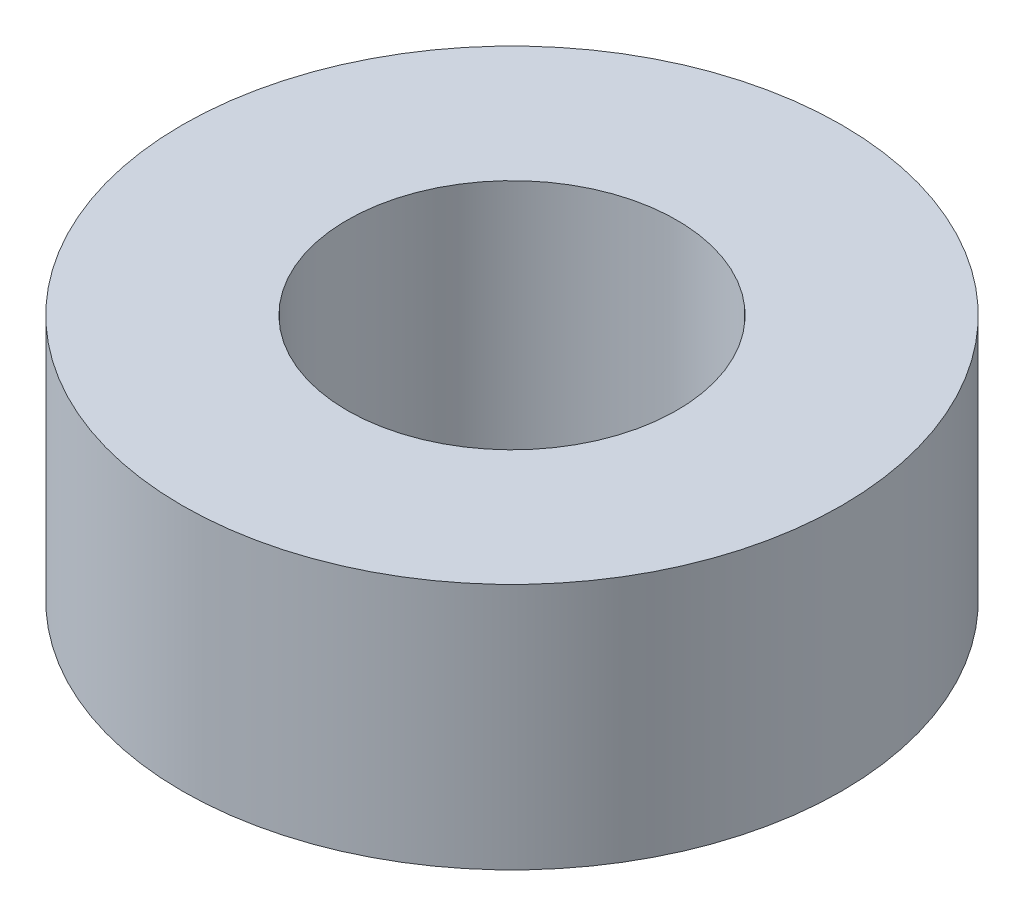
ISO-10303-21;
HEADER;
FILE_DESCRIPTION(('STEP AP214'),'2;1');
FILE_NAME('part.step','',(''),(''),'','','');
FILE_SCHEMA(('AUTOMOTIVE_DESIGN { 1 0 10303 214 1 1 1 1 }'));
ENDSEC;
DATA;
#1=APPLICATION_CONTEXT('core data for automotive mechanical design processes');
#2=APPLICATION_PROTOCOL_DEFINITION('international standard','automotive_design',2000,#1);
#3=PRODUCT_CONTEXT('',#1,'mechanical');
#4=PRODUCT('Part','Part','',(#3));
#5=PRODUCT_RELATED_PRODUCT_CATEGORY('part','',(#4));
#6=PRODUCT_DEFINITION_FORMATION('','',#4);
#7=PRODUCT_DEFINITION_CONTEXT('part definition',#1,'design');
#8=PRODUCT_DEFINITION('design','',#6,#7);
#9=PRODUCT_DEFINITION_SHAPE('','',#8);
#10=(LENGTH_UNIT() NAMED_UNIT(*) SI_UNIT(.MILLI.,.METRE.));
#11=(NAMED_UNIT(*) PLANE_ANGLE_UNIT() SI_UNIT($,.RADIAN.));
#12=(NAMED_UNIT(*) SI_UNIT($,.STERADIAN.) SOLID_ANGLE_UNIT());
#13=UNCERTAINTY_MEASURE_WITH_UNIT(LENGTH_MEASURE(1.E-05),#10,'distance_accuracy_value','');
#14=(GEOMETRIC_REPRESENTATION_CONTEXT(3) GLOBAL_UNCERTAINTY_ASSIGNED_CONTEXT((#13)) GLOBAL_UNIT_ASSIGNED_CONTEXT((#10,
#11,#12)) REPRESENTATION_CONTEXT('',''));
#15=CARTESIAN_POINT('',(0.,0.,0.));
#16=DIRECTION('',(0.,0.,1.));
#17=DIRECTION('',(1.,0.,0.));
#18=AXIS2_PLACEMENT_3D('',#15,#16,#17);
#19=CARTESIAN_POINT('',(0.,1.5,0.));
#20=DIRECTION('',(0.,1.,0.));
#21=DIRECTION('',(0.,0.,1.));
#22=AXIS2_PLACEMENT_3D('',#19,#20,#21);
#23=PLANE('',#22);
#24=CARTESIAN_POINT('',(0.,1.5,0.));
#25=DIRECTION('',(0.,1.,0.));
#26=DIRECTION('',(0.,0.,1.));
#27=AXIS2_PLACEMENT_3D('',#24,#25,#26);
#28=CIRCLE('',#27,4.);
#29=CARTESIAN_POINT('',(0.,1.5,4.));
#30=VERTEX_POINT('',#29);
#31=EDGE_CURVE('E10',#30,#30,#28,.T.);
#32=ORIENTED_EDGE('',*,*,#31,.T.);
#33=EDGE_LOOP('',(#32));
#34=FACE_BOUND('',#33,.T.);
#35=CARTESIAN_POINT('',(0.,1.5,0.));
#36=DIRECTION('',(0.,1.,0.));
#37=DIRECTION('',(0.,0.,1.));
#38=AXIS2_PLACEMENT_3D('',#35,#36,#37);
#39=CIRCLE('',#38,2.);
#40=CARTESIAN_POINT('',(0.,1.5,2.));
#41=VERTEX_POINT('',#40);
#42=EDGE_CURVE('E48',#41,#41,#39,.T.);
#43=ORIENTED_EDGE('',*,*,#42,.F.);
#44=EDGE_LOOP('',(#43));
#45=FACE_BOUND('',#44,.T.);
#46=ADVANCED_FACE('F37',(#34,#45),#23,.T.);
#47=CARTESIAN_POINT('',(0.,-1.5,0.));
#48=DIRECTION('',(0.,1.,0.));
#49=DIRECTION('',(0.,0.,1.));
#50=AXIS2_PLACEMENT_3D('',#47,#48,#49);
#51=PLANE('',#50);
#52=CARTESIAN_POINT('',(0.,-1.5,0.));
#53=DIRECTION('',(0.,1.,0.));
#54=DIRECTION('',(0.,0.,1.));
#55=AXIS2_PLACEMENT_3D('',#52,#53,#54);
#56=CIRCLE('',#55,4.);
#57=CARTESIAN_POINT('',(0.,-1.5,4.));
#58=VERTEX_POINT('',#57);
#59=EDGE_CURVE('E41',#58,#58,#56,.T.);
#60=ORIENTED_EDGE('',*,*,#59,.F.);
#61=EDGE_LOOP('',(#60));
#62=FACE_BOUND('',#61,.T.);
#63=CARTESIAN_POINT('',(0.,-1.5,0.));
#64=DIRECTION('',(0.,1.,0.));
#65=DIRECTION('',(0.,0.,1.));
#66=AXIS2_PLACEMENT_3D('',#63,#64,#65);
#67=CIRCLE('',#66,2.);
#68=CARTESIAN_POINT('',(0.,-1.5,2.));
#69=VERTEX_POINT('',#68);
#70=EDGE_CURVE('E50',#69,#69,#67,.T.);
#71=ORIENTED_EDGE('',*,*,#70,.T.);
#72=EDGE_LOOP('',(#71));
#73=FACE_BOUND('',#72,.T.);
#74=ADVANCED_FACE('F60',(#62,#73),#51,.F.);
#75=CARTESIAN_POINT('',(0.,1.5,0.));
#76=DIRECTION('',(0.,-1.,0.));
#77=DIRECTION('',(0.,0.,-1.));
#78=AXIS2_PLACEMENT_3D('',#75,#76,#77);
#79=CYLINDRICAL_SURFACE('',#78,4.);
#80=ORIENTED_EDGE('',*,*,#31,.F.);
#81=EDGE_LOOP('',(#80));
#82=FACE_BOUND('',#81,.T.);
#83=ORIENTED_EDGE('',*,*,#59,.T.);
#84=EDGE_LOOP('',(#83));
#85=FACE_BOUND('',#84,.T.);
#86=ADVANCED_FACE('F39',(#82,#85),#79,.T.);
#87=CARTESIAN_POINT('',(0.,1.5,0.));
#88=DIRECTION('',(0.,-1.,0.));
#89=DIRECTION('',(0.,0.,-1.));
#90=AXIS2_PLACEMENT_3D('',#87,#88,#89);
#91=CYLINDRICAL_SURFACE('',#90,2.);
#92=ORIENTED_EDGE('',*,*,#42,.T.);
#93=EDGE_LOOP('',(#92));
#94=FACE_BOUND('',#93,.T.);
#95=ORIENTED_EDGE('',*,*,#70,.F.);
#96=EDGE_LOOP('',(#95));
#97=FACE_BOUND('',#96,.T.);
#98=ADVANCED_FACE('F56',(#94,#97),#91,.F.);
#99=CLOSED_SHELL('',(#46,#74,#86,#98));
#100=MANIFOLD_SOLID_BREP('B2',#99);
#101=ADVANCED_BREP_SHAPE_REPRESENTATION('',(#18,#100),#14);
#102=SHAPE_DEFINITION_REPRESENTATION(#9,#101);
ENDSEC;
END-ISO-10303-21;
